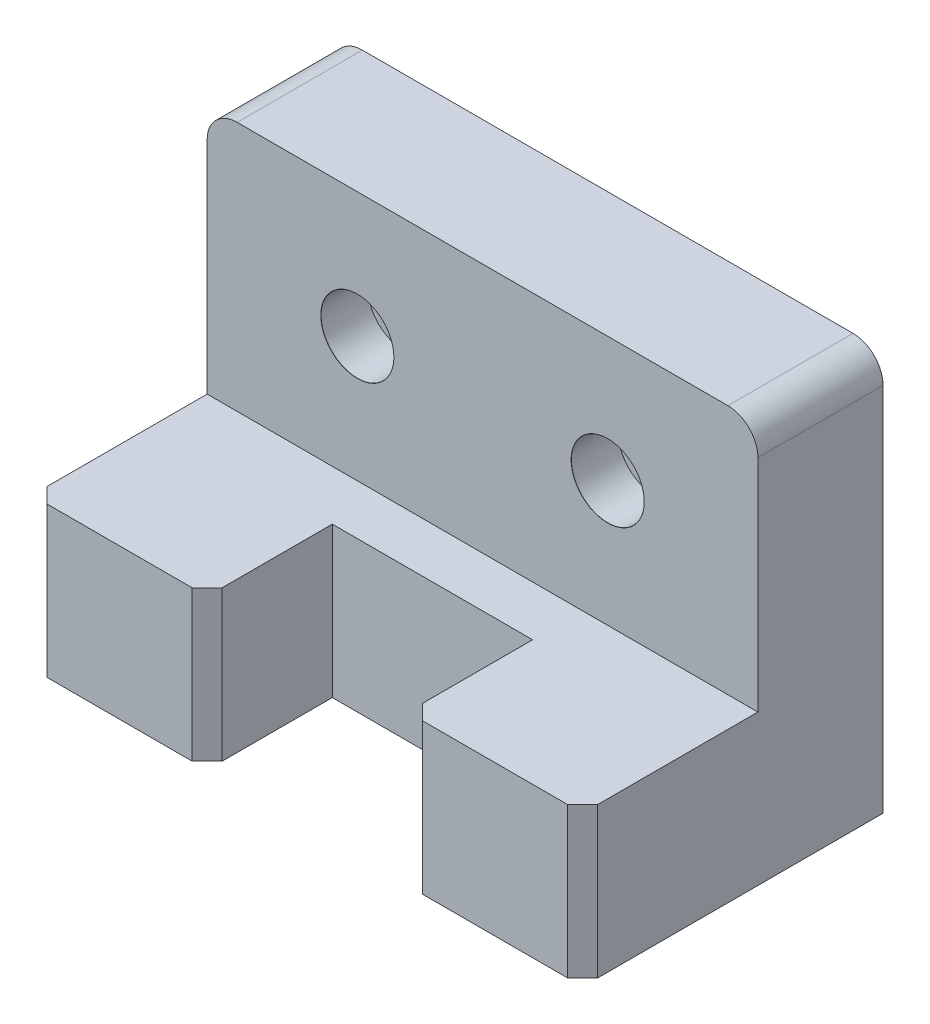
ISO-10303-21;
HEADER;
FILE_DESCRIPTION(('STEP AP214'),'2;1');
FILE_NAME('part.step','',(''),(''),'','','');
FILE_SCHEMA(('AUTOMOTIVE_DESIGN { 1 0 10303 214 1 1 1 1 }'));
ENDSEC;
DATA;
#1=APPLICATION_CONTEXT('core data for automotive mechanical design processes');
#2=APPLICATION_PROTOCOL_DEFINITION('international standard','automotive_design',2000,#1);
#3=PRODUCT_CONTEXT('',#1,'mechanical');
#4=PRODUCT('Part','Part','',(#3));
#5=PRODUCT_RELATED_PRODUCT_CATEGORY('part','',(#4));
#6=PRODUCT_DEFINITION_FORMATION('','',#4);
#7=PRODUCT_DEFINITION_CONTEXT('part definition',#1,'design');
#8=PRODUCT_DEFINITION('design','',#6,#7);
#9=PRODUCT_DEFINITION_SHAPE('','',#8);
#10=(LENGTH_UNIT() NAMED_UNIT(*) SI_UNIT(.MILLI.,.METRE.));
#11=(NAMED_UNIT(*) PLANE_ANGLE_UNIT() SI_UNIT($,.RADIAN.));
#12=(NAMED_UNIT(*) SI_UNIT($,.STERADIAN.) SOLID_ANGLE_UNIT());
#13=UNCERTAINTY_MEASURE_WITH_UNIT(LENGTH_MEASURE(1.E-05),#10,'distance_accuracy_value','');
#14=(GEOMETRIC_REPRESENTATION_CONTEXT(3) GLOBAL_UNCERTAINTY_ASSIGNED_CONTEXT((#13)) GLOBAL_UNIT_ASSIGNED_CONTEXT((#10,
#11,#12)) REPRESENTATION_CONTEXT('',''));
#15=CARTESIAN_POINT('',(0.,0.,0.));
#16=DIRECTION('',(0.,0.,1.));
#17=DIRECTION('',(1.,0.,0.));
#18=AXIS2_PLACEMENT_3D('',#15,#16,#17);
#19=CARTESIAN_POINT('',(-55.,80.,57.));
#20=DIRECTION('',(0.707106781186548,0.,-0.707106781186548));
#21=DIRECTION('',(-0.707106781186548,0.,-0.707106781186548));
#22=AXIS2_PLACEMENT_3D('',#19,#20,#21);
#23=PLANE('',#22);
#24=DIRECTION('',(0.707106781186548,0.,0.707106781186548));
#25=VECTOR('',#24,1.);
#26=CARTESIAN_POINT('',(-55.,30.,57.));
#27=LINE('',#26,#25);
#28=CARTESIAN_POINT('',(-55.,30.,57.));
#29=VERTEX_POINT('',#28);
#30=CARTESIAN_POINT('',(-52.,30.,60.));
#31=VERTEX_POINT('',#30);
#32=EDGE_CURVE('E184',#29,#31,#27,.T.);
#33=ORIENTED_EDGE('',*,*,#32,.F.);
#34=DIRECTION('',(0.,-1.,0.));
#35=VECTOR('',#34,1.);
#36=CARTESIAN_POINT('',(-55.,80.,57.));
#37=LINE('',#36,#35);
#38=CARTESIAN_POINT('',(-55.,0.,57.));
#39=VERTEX_POINT('',#38);
#40=EDGE_CURVE('E181',#29,#39,#37,.T.);
#41=ORIENTED_EDGE('',*,*,#40,.T.);
#42=DIRECTION('',(0.707106781186547,0.,0.707106781186547));
#43=VECTOR('',#42,1.);
#44=CARTESIAN_POINT('',(-55.,0.,57.));
#45=LINE('',#44,#43);
#46=CARTESIAN_POINT('',(-52.,0.,60.));
#47=VERTEX_POINT('',#46);
#48=EDGE_CURVE('E188',#39,#47,#45,.T.);
#49=ORIENTED_EDGE('',*,*,#48,.T.);
#50=DIRECTION('',(0.,-1.,0.));
#51=VECTOR('',#50,1.);
#52=CARTESIAN_POINT('',(-52.,80.,60.));
#53=LINE('',#52,#51);
#54=EDGE_CURVE('E271',#31,#47,#53,.T.);
#55=ORIENTED_EDGE('',*,*,#54,.F.);
#56=EDGE_LOOP('',(#33,#41,#49,#55));
#57=FACE_BOUND('',#56,.T.);
#58=ADVANCED_FACE('F45',(#57),#23,.F.);
#59=CARTESIAN_POINT('',(-52.,80.,60.));
#60=DIRECTION('',(0.,0.,-1.));
#61=DIRECTION('',(-1.,0.,0.));
#62=AXIS2_PLACEMENT_3D('',#59,#60,#61);
#63=PLANE('',#62);
#64=DIRECTION('',(1.,0.,0.));
#65=VECTOR('',#64,1.);
#66=CARTESIAN_POINT('',(-52.,30.,60.));
#67=LINE('',#66,#65);
#68=CARTESIAN_POINT('',(-23.,30.,60.));
#69=VERTEX_POINT('',#68);
#70=EDGE_CURVE('E190',#31,#69,#67,.T.);
#71=ORIENTED_EDGE('',*,*,#70,.F.);
#72=ORIENTED_EDGE('',*,*,#54,.T.);
#73=DIRECTION('',(1.,0.,0.));
#74=VECTOR('',#73,1.);
#75=CARTESIAN_POINT('',(-52.,0.,60.));
#76=LINE('',#75,#74);
#77=CARTESIAN_POINT('',(-23.,0.,60.));
#78=VERTEX_POINT('',#77);
#79=EDGE_CURVE('E203',#47,#78,#76,.T.);
#80=ORIENTED_EDGE('',*,*,#79,.T.);
#81=DIRECTION('',(0.,-1.,0.));
#82=VECTOR('',#81,1.);
#83=CARTESIAN_POINT('',(-23.,80.,60.));
#84=LINE('',#83,#82);
#85=EDGE_CURVE('E268',#69,#78,#84,.T.);
#86=ORIENTED_EDGE('',*,*,#85,.F.);
#87=EDGE_LOOP('',(#71,#72,#80,#86));
#88=FACE_BOUND('',#87,.T.);
#89=ADVANCED_FACE('F332',(#88),#63,.F.);
#90=CARTESIAN_POINT('',(-23.,80.,60.));
#91=DIRECTION('',(-0.707106781186548,0.,-0.707106781186547));
#92=DIRECTION('',(-0.707106781186547,0.,0.707106781186548));
#93=AXIS2_PLACEMENT_3D('',#90,#91,#92);
#94=PLANE('',#93);
#95=DIRECTION('',(0.707106781186547,0.,-0.707106781186548));
#96=VECTOR('',#95,1.);
#97=CARTESIAN_POINT('',(-23.,30.,60.));
#98=LINE('',#97,#96);
#99=CARTESIAN_POINT('',(-20.,30.,57.));
#100=VERTEX_POINT('',#99);
#101=EDGE_CURVE('E382',#69,#100,#98,.T.);
#102=ORIENTED_EDGE('',*,*,#101,.F.);
#103=ORIENTED_EDGE('',*,*,#85,.T.);
#104=DIRECTION('',(0.707106781186547,0.,-0.707106781186548));
#105=VECTOR('',#104,1.);
#106=CARTESIAN_POINT('',(-23.,0.,60.));
#107=LINE('',#106,#105);
#108=CARTESIAN_POINT('',(-20.,0.,57.));
#109=VERTEX_POINT('',#108);
#110=EDGE_CURVE('E207',#78,#109,#107,.T.);
#111=ORIENTED_EDGE('',*,*,#110,.T.);
#112=DIRECTION('',(0.,-1.,0.));
#113=VECTOR('',#112,1.);
#114=CARTESIAN_POINT('',(-20.,80.,57.));
#115=LINE('',#114,#113);
#116=EDGE_CURVE('E265',#100,#109,#115,.T.);
#117=ORIENTED_EDGE('',*,*,#116,.F.);
#118=EDGE_LOOP('',(#102,#103,#111,#117));
#119=FACE_BOUND('',#118,.T.);
#120=ADVANCED_FACE('F338',(#119),#94,.F.);
#121=CARTESIAN_POINT('',(-20.,80.,57.));
#122=DIRECTION('',(-1.,0.,0.));
#123=DIRECTION('',(0.,0.,1.));
#124=AXIS2_PLACEMENT_3D('',#121,#122,#123);
#125=PLANE('',#124);
#126=DIRECTION('',(0.,0.,-1.));
#127=VECTOR('',#126,1.);
#128=CARTESIAN_POINT('',(-20.,30.,57.));
#129=LINE('',#128,#127);
#130=CARTESIAN_POINT('',(-20.,30.,35.));
#131=VERTEX_POINT('',#130);
#132=EDGE_CURVE('E386',#100,#131,#129,.T.);
#133=ORIENTED_EDGE('',*,*,#132,.F.);
#134=ORIENTED_EDGE('',*,*,#116,.T.);
#135=DIRECTION('',(0.,0.,-1.));
#136=VECTOR('',#135,1.);
#137=CARTESIAN_POINT('',(-20.,0.,57.));
#138=LINE('',#137,#136);
#139=CARTESIAN_POINT('',(-20.,0.,35.));
#140=VERTEX_POINT('',#139);
#141=EDGE_CURVE('E211',#109,#140,#138,.T.);
#142=ORIENTED_EDGE('',*,*,#141,.T.);
#143=DIRECTION('',(0.,-1.,0.));
#144=VECTOR('',#143,1.);
#145=CARTESIAN_POINT('',(-20.,80.,35.));
#146=LINE('',#145,#144);
#147=EDGE_CURVE('E262',#131,#140,#146,.T.);
#148=ORIENTED_EDGE('',*,*,#147,.F.);
#149=EDGE_LOOP('',(#133,#134,#142,#148));
#150=FACE_BOUND('',#149,.T.);
#151=ADVANCED_FACE('F372',(#150),#125,.F.);
#152=CARTESIAN_POINT('',(-20.,80.,35.));
#153=DIRECTION('',(0.,0.,-1.));
#154=DIRECTION('',(-1.,0.,0.));
#155=AXIS2_PLACEMENT_3D('',#152,#153,#154);
#156=PLANE('',#155);
#157=DIRECTION('',(1.,0.,0.));
#158=VECTOR('',#157,1.);
#159=CARTESIAN_POINT('',(-20.,30.,35.));
#160=LINE('',#159,#158);
#161=CARTESIAN_POINT('',(20.,30.,35.));
#162=VERTEX_POINT('',#161);
#163=EDGE_CURVE('E398',#131,#162,#160,.T.);
#164=ORIENTED_EDGE('',*,*,#163,.F.);
#165=ORIENTED_EDGE('',*,*,#147,.T.);
#166=DIRECTION('',(1.,0.,0.));
#167=VECTOR('',#166,1.);
#168=CARTESIAN_POINT('',(-20.,0.,35.));
#169=LINE('',#168,#167);
#170=CARTESIAN_POINT('',(20.,0.,35.));
#171=VERTEX_POINT('',#170);
#172=EDGE_CURVE('E215',#140,#171,#169,.T.);
#173=ORIENTED_EDGE('',*,*,#172,.T.);
#174=DIRECTION('',(0.,-1.,0.));
#175=VECTOR('',#174,1.);
#176=CARTESIAN_POINT('',(20.,80.,35.));
#177=LINE('',#176,#175);
#178=EDGE_CURVE('E259',#162,#171,#177,.T.);
#179=ORIENTED_EDGE('',*,*,#178,.F.);
#180=EDGE_LOOP('',(#164,#165,#173,#179));
#181=FACE_BOUND('',#180,.T.);
#182=ADVANCED_FACE('F368',(#181),#156,.F.);
#183=CARTESIAN_POINT('',(20.,80.,35.));
#184=DIRECTION('',(1.,0.,0.));
#185=DIRECTION('',(0.,0.,-1.));
#186=AXIS2_PLACEMENT_3D('',#183,#184,#185);
#187=PLANE('',#186);
#188=DIRECTION('',(0.,0.,1.));
#189=VECTOR('',#188,1.);
#190=CARTESIAN_POINT('',(20.,30.,35.));
#191=LINE('',#190,#189);
#192=CARTESIAN_POINT('',(20.,30.,57.));
#193=VERTEX_POINT('',#192);
#194=EDGE_CURVE('E401',#162,#193,#191,.T.);
#195=ORIENTED_EDGE('',*,*,#194,.F.);
#196=ORIENTED_EDGE('',*,*,#178,.T.);
#197=DIRECTION('',(0.,0.,1.));
#198=VECTOR('',#197,1.);
#199=CARTESIAN_POINT('',(20.,0.,35.));
#200=LINE('',#199,#198);
#201=CARTESIAN_POINT('',(20.,0.,57.));
#202=VERTEX_POINT('',#201);
#203=EDGE_CURVE('E219',#171,#202,#200,.T.);
#204=ORIENTED_EDGE('',*,*,#203,.T.);
#205=DIRECTION('',(0.,-1.,0.));
#206=VECTOR('',#205,1.);
#207=CARTESIAN_POINT('',(20.,80.,57.));
#208=LINE('',#207,#206);
#209=EDGE_CURVE('E256',#193,#202,#208,.T.);
#210=ORIENTED_EDGE('',*,*,#209,.F.);
#211=EDGE_LOOP('',(#195,#196,#204,#210));
#212=FACE_BOUND('',#211,.T.);
#213=ADVANCED_FACE('F364',(#212),#187,.F.);
#214=CARTESIAN_POINT('',(20.,80.,57.));
#215=DIRECTION('',(0.707106781186548,0.,-0.707106781186547));
#216=DIRECTION('',(-0.707106781186547,0.,-0.707106781186548));
#217=AXIS2_PLACEMENT_3D('',#214,#215,#216);
#218=PLANE('',#217);
#219=DIRECTION('',(0.707106781186547,0.,0.707106781186548));
#220=VECTOR('',#219,1.);
#221=CARTESIAN_POINT('',(20.,30.,57.));
#222=LINE('',#221,#220);
#223=CARTESIAN_POINT('',(23.,30.,60.));
#224=VERTEX_POINT('',#223);
#225=EDGE_CURVE('E407',#193,#224,#222,.T.);
#226=ORIENTED_EDGE('',*,*,#225,.F.);
#227=ORIENTED_EDGE('',*,*,#209,.T.);
#228=DIRECTION('',(0.707106781186547,0.,0.707106781186548));
#229=VECTOR('',#228,1.);
#230=CARTESIAN_POINT('',(20.,0.,57.));
#231=LINE('',#230,#229);
#232=CARTESIAN_POINT('',(23.,0.,60.));
#233=VERTEX_POINT('',#232);
#234=EDGE_CURVE('E223',#202,#233,#231,.T.);
#235=ORIENTED_EDGE('',*,*,#234,.T.);
#236=DIRECTION('',(0.,-1.,0.));
#237=VECTOR('',#236,1.);
#238=CARTESIAN_POINT('',(23.,80.,60.));
#239=LINE('',#238,#237);
#240=EDGE_CURVE('E253',#224,#233,#239,.T.);
#241=ORIENTED_EDGE('',*,*,#240,.F.);
#242=EDGE_LOOP('',(#226,#227,#235,#241));
#243=FACE_BOUND('',#242,.T.);
#244=ADVANCED_FACE('F356',(#243),#218,.F.);
#245=CARTESIAN_POINT('',(23.,80.,60.));
#246=DIRECTION('',(0.,0.,-1.));
#247=DIRECTION('',(-1.,0.,0.));
#248=AXIS2_PLACEMENT_3D('',#245,#246,#247);
#249=PLANE('',#248);
#250=DIRECTION('',(1.,0.,0.));
#251=VECTOR('',#250,1.);
#252=CARTESIAN_POINT('',(23.,30.,60.));
#253=LINE('',#252,#251);
#254=CARTESIAN_POINT('',(52.,30.,60.));
#255=VERTEX_POINT('',#254);
#256=EDGE_CURVE('E410',#224,#255,#253,.T.);
#257=ORIENTED_EDGE('',*,*,#256,.F.);
#258=ORIENTED_EDGE('',*,*,#240,.T.);
#259=DIRECTION('',(1.,0.,0.));
#260=VECTOR('',#259,1.);
#261=CARTESIAN_POINT('',(23.,0.,60.));
#262=LINE('',#261,#260);
#263=CARTESIAN_POINT('',(52.,0.,60.));
#264=VERTEX_POINT('',#263);
#265=EDGE_CURVE('E227',#233,#264,#262,.T.);
#266=ORIENTED_EDGE('',*,*,#265,.T.);
#267=DIRECTION('',(0.,-1.,0.));
#268=VECTOR('',#267,1.);
#269=CARTESIAN_POINT('',(52.,80.,60.));
#270=LINE('',#269,#268);
#271=EDGE_CURVE('E250',#255,#264,#270,.T.);
#272=ORIENTED_EDGE('',*,*,#271,.F.);
#273=EDGE_LOOP('',(#257,#258,#266,#272));
#274=FACE_BOUND('',#273,.T.);
#275=ADVANCED_FACE('F350',(#274),#249,.F.);
#276=CARTESIAN_POINT('',(52.,80.,60.));
#277=DIRECTION('',(-0.707106781186548,0.,-0.707106781186548));
#278=DIRECTION('',(-0.707106781186548,0.,0.707106781186548));
#279=AXIS2_PLACEMENT_3D('',#276,#277,#278);
#280=PLANE('',#279);
#281=DIRECTION('',(0.707106781186548,0.,-0.707106781186548));
#282=VECTOR('',#281,1.);
#283=CARTESIAN_POINT('',(52.,30.,60.));
#284=LINE('',#283,#282);
#285=CARTESIAN_POINT('',(55.,30.,57.));
#286=VERTEX_POINT('',#285);
#287=EDGE_CURVE('E165',#255,#286,#284,.T.);
#288=ORIENTED_EDGE('',*,*,#287,.F.);
#289=ORIENTED_EDGE('',*,*,#271,.T.);
#290=DIRECTION('',(0.707106781186547,0.,-0.707106781186547));
#291=VECTOR('',#290,1.);
#292=CARTESIAN_POINT('',(52.,0.,60.));
#293=LINE('',#292,#291);
#294=CARTESIAN_POINT('',(55.,0.,57.));
#295=VERTEX_POINT('',#294);
#296=EDGE_CURVE('E231',#264,#295,#293,.T.);
#297=ORIENTED_EDGE('',*,*,#296,.T.);
#298=DIRECTION('',(0.,-1.,0.));
#299=VECTOR('',#298,1.);
#300=CARTESIAN_POINT('',(55.,80.,57.));
#301=LINE('',#300,#299);
#302=EDGE_CURVE('E247',#286,#295,#301,.T.);
#303=ORIENTED_EDGE('',*,*,#302,.F.);
#304=EDGE_LOOP('',(#288,#289,#297,#303));
#305=FACE_BOUND('',#304,.T.);
#306=ADVANCED_FACE('F344',(#305),#280,.F.);
#307=CARTESIAN_POINT('',(-55.,80.,0.));
#308=DIRECTION('',(1.,0.,0.));
#309=DIRECTION('',(0.,0.,-1.));
#310=AXIS2_PLACEMENT_3D('',#307,#308,#309);
#311=PLANE('',#310);
#312=DIRECTION('',(0.,1.,0.));
#313=VECTOR('',#312,1.);
#314=CARTESIAN_POINT('',(-55.,80.,25.));
#315=LINE('',#314,#313);
#316=CARTESIAN_POINT('',(-55.,30.,25.));
#317=VERTEX_POINT('',#316);
#318=CARTESIAN_POINT('',(-55.,74.,25.));
#319=VERTEX_POINT('',#318);
#320=EDGE_CURVE('E157',#317,#319,#315,.T.);
#321=ORIENTED_EDGE('',*,*,#320,.T.);
#322=DIRECTION('',(0.,0.,1.));
#323=VECTOR('',#322,1.);
#324=CARTESIAN_POINT('',(-55.,74.,0.));
#325=LINE('',#324,#323);
#326=CARTESIAN_POINT('',(-55.,74.,0.));
#327=VERTEX_POINT('',#326);
#328=EDGE_CURVE('E12',#319,#327,#325,.F.);
#329=ORIENTED_EDGE('',*,*,#328,.T.);
#330=DIRECTION('',(0.,-1.,0.));
#331=VECTOR('',#330,1.);
#332=CARTESIAN_POINT('',(-55.,80.,0.));
#333=LINE('',#332,#331);
#334=CARTESIAN_POINT('',(-55.,0.,0.));
#335=VERTEX_POINT('',#334);
#336=EDGE_CURVE('E197',#327,#335,#333,.T.);
#337=ORIENTED_EDGE('',*,*,#336,.T.);
#338=DIRECTION('',(0.,0.,1.));
#339=VECTOR('',#338,1.);
#340=CARTESIAN_POINT('',(-55.,0.,0.));
#341=LINE('',#340,#339);
#342=EDGE_CURVE('E183',#335,#39,#341,.T.);
#343=ORIENTED_EDGE('',*,*,#342,.T.);
#344=ORIENTED_EDGE('',*,*,#40,.F.);
#345=DIRECTION('',(0.,0.,1.));
#346=VECTOR('',#345,1.);
#347=CARTESIAN_POINT('',(-55.,30.,0.));
#348=LINE('',#347,#346);
#349=EDGE_CURVE('E171',#317,#29,#348,.T.);
#350=ORIENTED_EDGE('',*,*,#349,.F.);
#351=EDGE_LOOP('',(#321,#329,#337,#343,#344,#350));
#352=FACE_BOUND('',#351,.T.);
#353=ADVANCED_FACE('F179',(#352),#311,.F.);
#354=CARTESIAN_POINT('',(55.,80.,0.));
#355=DIRECTION('',(-1.,0.,0.));
#356=DIRECTION('',(0.,0.,1.));
#357=AXIS2_PLACEMENT_3D('',#354,#355,#356);
#358=PLANE('',#357);
#359=DIRECTION('',(0.,-1.,0.));
#360=VECTOR('',#359,1.);
#361=CARTESIAN_POINT('',(55.,80.,0.));
#362=LINE('',#361,#360);
#363=CARTESIAN_POINT('',(55.,74.,0.));
#364=VERTEX_POINT('',#363);
#365=CARTESIAN_POINT('',(55.,0.,0.));
#366=VERTEX_POINT('',#365);
#367=EDGE_CURVE('E244',#364,#366,#362,.T.);
#368=ORIENTED_EDGE('',*,*,#367,.F.);
#369=DIRECTION('',(0.,0.,-1.));
#370=VECTOR('',#369,1.);
#371=CARTESIAN_POINT('',(55.,74.,25.));
#372=LINE('',#371,#370);
#373=CARTESIAN_POINT('',(55.,74.,25.));
#374=VERTEX_POINT('',#373);
#375=EDGE_CURVE('E69',#364,#374,#372,.F.);
#376=ORIENTED_EDGE('',*,*,#375,.T.);
#377=DIRECTION('',(0.,-1.,0.));
#378=VECTOR('',#377,1.);
#379=CARTESIAN_POINT('',(55.,80.,25.));
#380=LINE('',#379,#378);
#381=CARTESIAN_POINT('',(55.,30.,25.));
#382=VERTEX_POINT('',#381);
#383=EDGE_CURVE('E166',#374,#382,#380,.T.);
#384=ORIENTED_EDGE('',*,*,#383,.T.);
#385=DIRECTION('',(0.,0.,-1.));
#386=VECTOR('',#385,1.);
#387=CARTESIAN_POINT('',(55.,30.,0.));
#388=LINE('',#387,#386);
#389=EDGE_CURVE('E174',#286,#382,#388,.T.);
#390=ORIENTED_EDGE('',*,*,#389,.F.);
#391=ORIENTED_EDGE('',*,*,#302,.T.);
#392=DIRECTION('',(0.,0.,-1.));
#393=VECTOR('',#392,1.);
#394=CARTESIAN_POINT('',(55.,0.,0.));
#395=LINE('',#394,#393);
#396=EDGE_CURVE('E235',#295,#366,#395,.T.);
#397=ORIENTED_EDGE('',*,*,#396,.T.);
#398=EDGE_LOOP('',(#368,#376,#384,#390,#391,#397));
#399=FACE_BOUND('',#398,.T.);
#400=ADVANCED_FACE('F310',(#399),#358,.F.);
#401=CARTESIAN_POINT('',(-55.,80.,0.));
#402=DIRECTION('',(0.,0.,1.));
#403=DIRECTION('',(1.,0.,0.));
#404=AXIS2_PLACEMENT_3D('',#401,#402,#403);
#405=PLANE('',#404);
#406=CARTESIAN_POINT('',(-25.,55.,0.));
#407=DIRECTION('',(0.,0.,1.));
#408=DIRECTION('',(1.,0.,0.));
#409=AXIS2_PLACEMENT_3D('',#406,#407,#408);
#410=CIRCLE('',#409,3.2);
#411=CARTESIAN_POINT('',(-21.8,55.,0.));
#412=VERTEX_POINT('',#411);
#413=EDGE_CURVE('E436',#412,#412,#410,.T.);
#414=ORIENTED_EDGE('',*,*,#413,.T.);
#415=EDGE_LOOP('',(#414));
#416=FACE_BOUND('',#415,.T.);
#417=CARTESIAN_POINT('',(25.,55.,0.));
#418=DIRECTION('',(0.,0.,1.));
#419=DIRECTION('',(1.,0.,0.));
#420=AXIS2_PLACEMENT_3D('',#417,#418,#419);
#421=CIRCLE('',#420,3.2);
#422=CARTESIAN_POINT('',(28.2,55.,0.));
#423=VERTEX_POINT('',#422);
#424=EDGE_CURVE('E176',#423,#423,#421,.T.);
#425=ORIENTED_EDGE('',*,*,#424,.T.);
#426=EDGE_LOOP('',(#425));
#427=FACE_BOUND('',#426,.T.);
#428=DIRECTION('',(-1.,0.,0.));
#429=VECTOR('',#428,1.);
#430=CARTESIAN_POINT('',(-55.,80.,0.));
#431=LINE('',#430,#429);
#432=CARTESIAN_POINT('',(49.,80.,0.));
#433=VERTEX_POINT('',#432);
#434=CARTESIAN_POINT('',(-49.,80.,0.));
#435=VERTEX_POINT('',#434);
#436=EDGE_CURVE('E194',#433,#435,#431,.T.);
#437=ORIENTED_EDGE('',*,*,#436,.F.);
#438=CARTESIAN_POINT('',(49.,74.,0.));
#439=DIRECTION('',(0.,0.,1.));
#440=DIRECTION('',(1.,0.,0.));
#441=AXIS2_PLACEMENT_3D('',#438,#439,#440);
#442=CIRCLE('',#441,6.);
#443=EDGE_CURVE('E292',#433,#364,#442,.F.);
#444=ORIENTED_EDGE('',*,*,#443,.T.);
#445=ORIENTED_EDGE('',*,*,#367,.T.);
#446=DIRECTION('',(-1.,0.,0.));
#447=VECTOR('',#446,1.);
#448=CARTESIAN_POINT('',(-55.,0.,0.));
#449=LINE('',#448,#447);
#450=EDGE_CURVE('E198',#366,#335,#449,.T.);
#451=ORIENTED_EDGE('',*,*,#450,.T.);
#452=ORIENTED_EDGE('',*,*,#336,.F.);
#453=CARTESIAN_POINT('',(-49.,74.,0.));
#454=DIRECTION('',(0.,0.,1.));
#455=DIRECTION('',(1.,0.,0.));
#456=AXIS2_PLACEMENT_3D('',#453,#454,#455);
#457=CIRCLE('',#456,6.);
#458=EDGE_CURVE('E289',#327,#435,#457,.F.);
#459=ORIENTED_EDGE('',*,*,#458,.T.);
#460=EDGE_LOOP('',(#437,#444,#445,#451,#452,#459));
#461=FACE_BOUND('',#460,.T.);
#462=ADVANCED_FACE('F309',(#416,#427,#461),#405,.F.);
#463=CARTESIAN_POINT('',(0.,80.,0.));
#464=DIRECTION('',(0.,1.,0.));
#465=DIRECTION('',(0.,0.,1.));
#466=AXIS2_PLACEMENT_3D('',#463,#464,#465);
#467=PLANE('',#466);
#468=DIRECTION('',(-1.,0.,0.));
#469=VECTOR('',#468,1.);
#470=CARTESIAN_POINT('',(0.,80.,25.));
#471=LINE('',#470,#469);
#472=CARTESIAN_POINT('',(49.,80.,25.));
#473=VERTEX_POINT('',#472);
#474=CARTESIAN_POINT('',(-49.,80.,25.));
#475=VERTEX_POINT('',#474);
#476=EDGE_CURVE('E276',#473,#475,#471,.T.);
#477=ORIENTED_EDGE('',*,*,#476,.F.);
#478=DIRECTION('',(0.,0.,-1.));
#479=VECTOR('',#478,1.);
#480=CARTESIAN_POINT('',(49.,80.,0.));
#481=LINE('',#480,#479);
#482=EDGE_CURVE('E285',#473,#433,#481,.T.);
#483=ORIENTED_EDGE('',*,*,#482,.T.);
#484=ORIENTED_EDGE('',*,*,#436,.T.);
#485=DIRECTION('',(0.,0.,1.));
#486=VECTOR('',#485,1.);
#487=CARTESIAN_POINT('',(-49.,80.,25.));
#488=LINE('',#487,#486);
#489=EDGE_CURVE('E281',#435,#475,#488,.T.);
#490=ORIENTED_EDGE('',*,*,#489,.T.);
#491=EDGE_LOOP('',(#477,#483,#484,#490));
#492=FACE_BOUND('',#491,.T.);
#493=ADVANCED_FACE('F304',(#492),#467,.T.);
#494=CARTESIAN_POINT('',(0.,0.,0.));
#495=DIRECTION('',(0.,1.,0.));
#496=DIRECTION('',(0.,0.,1.));
#497=AXIS2_PLACEMENT_3D('',#494,#495,#496);
#498=PLANE('',#497);
#499=ORIENTED_EDGE('',*,*,#342,.F.);
#500=ORIENTED_EDGE('',*,*,#450,.F.);
#501=ORIENTED_EDGE('',*,*,#396,.F.);
#502=ORIENTED_EDGE('',*,*,#296,.F.);
#503=ORIENTED_EDGE('',*,*,#265,.F.);
#504=ORIENTED_EDGE('',*,*,#234,.F.);
#505=ORIENTED_EDGE('',*,*,#203,.F.);
#506=ORIENTED_EDGE('',*,*,#172,.F.);
#507=ORIENTED_EDGE('',*,*,#141,.F.);
#508=ORIENTED_EDGE('',*,*,#110,.F.);
#509=ORIENTED_EDGE('',*,*,#79,.F.);
#510=ORIENTED_EDGE('',*,*,#48,.F.);
#511=EDGE_LOOP('',(#499,#500,#501,#502,#503,#504,#505,#506,#507,#508,#509,#510));
#512=FACE_BOUND('',#511,.T.);
#513=ADVANCED_FACE('F317',(#512),#498,.F.);
#514=CARTESIAN_POINT('',(0.,30.,0.));
#515=DIRECTION('',(0.,1.,0.));
#516=DIRECTION('',(0.,0.,1.));
#517=AXIS2_PLACEMENT_3D('',#514,#515,#516);
#518=PLANE('',#517);
#519=ORIENTED_EDGE('',*,*,#349,.T.);
#520=ORIENTED_EDGE('',*,*,#32,.T.);
#521=ORIENTED_EDGE('',*,*,#70,.T.);
#522=ORIENTED_EDGE('',*,*,#101,.T.);
#523=ORIENTED_EDGE('',*,*,#132,.T.);
#524=ORIENTED_EDGE('',*,*,#163,.T.);
#525=ORIENTED_EDGE('',*,*,#194,.T.);
#526=ORIENTED_EDGE('',*,*,#225,.T.);
#527=ORIENTED_EDGE('',*,*,#256,.T.);
#528=ORIENTED_EDGE('',*,*,#287,.T.);
#529=ORIENTED_EDGE('',*,*,#389,.T.);
#530=DIRECTION('',(1.,0.,0.));
#531=VECTOR('',#530,1.);
#532=CARTESIAN_POINT('',(-64.3628860619649,30.,25.));
#533=LINE('',#532,#531);
#534=EDGE_CURVE('E160',#317,#382,#533,.T.);
#535=ORIENTED_EDGE('',*,*,#534,.F.);
#536=EDGE_LOOP('',(#519,#520,#521,#522,#523,#524,#525,#526,#527,#528,#529,#535));
#537=FACE_BOUND('',#536,.T.);
#538=ADVANCED_FACE('F170',(#537),#518,.T.);
#539=CARTESIAN_POINT('',(-64.3628860619649,-136.327923675116,25.));
#540=DIRECTION('',(0.,0.,-1.));
#541=DIRECTION('',(-1.,0.,0.));
#542=AXIS2_PLACEMENT_3D('',#539,#540,#541);
#543=PLANE('',#542);
#544=CARTESIAN_POINT('',(-25.,55.,25.));
#545=DIRECTION('',(0.,0.,1.));
#546=DIRECTION('',(1.,0.,0.));
#547=AXIS2_PLACEMENT_3D('',#544,#545,#546);
#548=CIRCLE('',#547,7.3);
#549=CARTESIAN_POINT('',(-17.7,55.,25.));
#550=VERTEX_POINT('',#549);
#551=EDGE_CURVE('E452',#550,#550,#548,.T.);
#552=ORIENTED_EDGE('',*,*,#551,.F.);
#553=EDGE_LOOP('',(#552));
#554=FACE_BOUND('',#553,.T.);
#555=CARTESIAN_POINT('',(25.,55.,25.));
#556=DIRECTION('',(0.,0.,1.));
#557=DIRECTION('',(1.,0.,0.));
#558=AXIS2_PLACEMENT_3D('',#555,#556,#557);
#559=CIRCLE('',#558,7.3);
#560=CARTESIAN_POINT('',(32.3,55.,25.));
#561=VERTEX_POINT('',#560);
#562=EDGE_CURVE('E432',#561,#561,#559,.T.);
#563=ORIENTED_EDGE('',*,*,#562,.F.);
#564=EDGE_LOOP('',(#563));
#565=FACE_BOUND('',#564,.T.);
#566=ORIENTED_EDGE('',*,*,#383,.F.);
#567=CARTESIAN_POINT('',(49.,74.,25.));
#568=DIRECTION('',(0.,0.,-1.));
#569=DIRECTION('',(-1.,0.,0.));
#570=AXIS2_PLACEMENT_3D('',#567,#568,#569);
#571=CIRCLE('',#570,6.);
#572=EDGE_CURVE('E54',#374,#473,#571,.F.);
#573=ORIENTED_EDGE('',*,*,#572,.T.);
#574=ORIENTED_EDGE('',*,*,#476,.T.);
#575=CARTESIAN_POINT('',(-49.,74.,25.));
#576=DIRECTION('',(0.,0.,-1.));
#577=DIRECTION('',(-1.,0.,0.));
#578=AXIS2_PLACEMENT_3D('',#575,#576,#577);
#579=CIRCLE('',#578,6.);
#580=EDGE_CURVE('E61',#475,#319,#579,.F.);
#581=ORIENTED_EDGE('',*,*,#580,.T.);
#582=ORIENTED_EDGE('',*,*,#320,.F.);
#583=ORIENTED_EDGE('',*,*,#534,.T.);
#584=EDGE_LOOP('',(#566,#573,#574,#581,#582,#583));
#585=FACE_BOUND('',#584,.T.);
#586=ADVANCED_FACE('F159',(#554,#565,#585),#543,.F.);
#587=CARTESIAN_POINT('',(49.,74.,0.));
#588=DIRECTION('',(0.,0.,1.));
#589=DIRECTION('',(1.,0.,0.));
#590=AXIS2_PLACEMENT_3D('',#587,#588,#589);
#591=CYLINDRICAL_SURFACE('',#590,6.);
#592=ORIENTED_EDGE('',*,*,#572,.F.);
#593=ORIENTED_EDGE('',*,*,#375,.F.);
#594=ORIENTED_EDGE('',*,*,#443,.F.);
#595=ORIENTED_EDGE('',*,*,#482,.F.);
#596=EDGE_LOOP('',(#592,#593,#594,#595));
#597=FACE_BOUND('',#596,.T.);
#598=ADVANCED_FACE('F307',(#597),#591,.T.);
#599=CARTESIAN_POINT('',(-49.,74.,0.));
#600=DIRECTION('',(0.,0.,-1.));
#601=DIRECTION('',(-1.,0.,0.));
#602=AXIS2_PLACEMENT_3D('',#599,#600,#601);
#603=CYLINDRICAL_SURFACE('',#602,6.);
#604=ORIENTED_EDGE('',*,*,#458,.F.);
#605=ORIENTED_EDGE('',*,*,#328,.F.);
#606=ORIENTED_EDGE('',*,*,#580,.F.);
#607=ORIENTED_EDGE('',*,*,#489,.F.);
#608=EDGE_LOOP('',(#604,#605,#606,#607));
#609=FACE_BOUND('',#608,.T.);
#610=ADVANCED_FACE('F47',(#609),#603,.T.);
#611=CARTESIAN_POINT('',(25.,55.,25.));
#612=DIRECTION('',(0.,0.,1.));
#613=DIRECTION('',(1.,0.,0.));
#614=AXIS2_PLACEMENT_3D('',#611,#612,#613);
#615=CYLINDRICAL_SURFACE('',#614,3.2);
#616=ORIENTED_EDGE('',*,*,#424,.F.);
#617=EDGE_LOOP('',(#616));
#618=FACE_BOUND('',#617,.T.);
#619=CARTESIAN_POINT('',(25.,55.,15.62));
#620=DIRECTION('',(0.,0.,1.));
#621=DIRECTION('',(1.,0.,0.));
#622=AXIS2_PLACEMENT_3D('',#619,#620,#621);
#623=CIRCLE('',#622,3.2);
#624=CARTESIAN_POINT('',(28.2,55.,15.62));
#625=VERTEX_POINT('',#624);
#626=EDGE_CURVE('E420',#625,#625,#623,.T.);
#627=ORIENTED_EDGE('',*,*,#626,.T.);
#628=EDGE_LOOP('',(#627));
#629=FACE_BOUND('',#628,.T.);
#630=ADVANCED_FACE('F323',(#618,#629),#615,.F.);
#631=CARTESIAN_POINT('',(32.275,55.,15.62));
#632=DIRECTION('',(0.,0.,-1.));
#633=DIRECTION('',(-1.,0.,0.));
#634=AXIS2_PLACEMENT_3D('',#631,#632,#633);
#635=PLANE('',#634);
#636=ORIENTED_EDGE('',*,*,#626,.F.);
#637=EDGE_LOOP('',(#636));
#638=FACE_BOUND('',#637,.T.);
#639=CARTESIAN_POINT('',(25.,55.,15.62));
#640=DIRECTION('',(0.,0.,1.));
#641=DIRECTION('',(1.,0.,0.));
#642=AXIS2_PLACEMENT_3D('',#639,#640,#641);
#643=CIRCLE('',#642,7.275);
#644=CARTESIAN_POINT('',(32.275,55.,15.62));
#645=VERTEX_POINT('',#644);
#646=EDGE_CURVE('E424',#645,#645,#643,.T.);
#647=ORIENTED_EDGE('',*,*,#646,.T.);
#648=EDGE_LOOP('',(#647));
#649=FACE_BOUND('',#648,.T.);
#650=ADVANCED_FACE('F328',(#638,#649),#635,.F.);
#651=CARTESIAN_POINT('',(25.,55.,25.));
#652=DIRECTION('',(0.,0.,1.));
#653=DIRECTION('',(1.,0.,0.));
#654=AXIS2_PLACEMENT_3D('',#651,#652,#653);
#655=CYLINDRICAL_SURFACE('',#654,7.275);
#656=ORIENTED_EDGE('',*,*,#646,.F.);
#657=EDGE_LOOP('',(#656));
#658=FACE_BOUND('',#657,.T.);
#659=CARTESIAN_POINT('',(25.,55.,24.975));
#660=DIRECTION('',(0.,0.,1.));
#661=DIRECTION('',(1.,0.,0.));
#662=AXIS2_PLACEMENT_3D('',#659,#660,#661);
#663=CIRCLE('',#662,7.275);
#664=CARTESIAN_POINT('',(32.275,55.,24.975));
#665=VERTEX_POINT('',#664);
#666=EDGE_CURVE('E428',#665,#665,#663,.T.);
#667=ORIENTED_EDGE('',*,*,#666,.T.);
#668=EDGE_LOOP('',(#667));
#669=FACE_BOUND('',#668,.T.);
#670=ADVANCED_FACE('F467',(#658,#669),#655,.F.);
#671=CARTESIAN_POINT('',(25.,55.,25.));
#672=DIRECTION('',(0.,0.,1.));
#673=DIRECTION('',(1.,0.,0.));
#674=AXIS2_PLACEMENT_3D('',#671,#672,#673);
#675=CONICAL_SURFACE('',#674,7.3,0.785398163397518);
#676=ORIENTED_EDGE('',*,*,#666,.F.);
#677=EDGE_LOOP('',(#676));
#678=FACE_BOUND('',#677,.T.);
#679=ORIENTED_EDGE('',*,*,#562,.T.);
#680=EDGE_LOOP('',(#679));
#681=FACE_BOUND('',#680,.T.);
#682=ADVANCED_FACE('F464',(#678,#681),#675,.F.);
#683=CARTESIAN_POINT('',(-25.,55.,25.));
#684=DIRECTION('',(0.,0.,1.));
#685=DIRECTION('',(1.,0.,0.));
#686=AXIS2_PLACEMENT_3D('',#683,#684,#685);
#687=CYLINDRICAL_SURFACE('',#686,3.2);
#688=ORIENTED_EDGE('',*,*,#413,.F.);
#689=EDGE_LOOP('',(#688));
#690=FACE_BOUND('',#689,.T.);
#691=CARTESIAN_POINT('',(-25.,55.,15.62));
#692=DIRECTION('',(0.,0.,1.));
#693=DIRECTION('',(1.,0.,0.));
#694=AXIS2_PLACEMENT_3D('',#691,#692,#693);
#695=CIRCLE('',#694,3.2);
#696=CARTESIAN_POINT('',(-21.8,55.,15.62));
#697=VERTEX_POINT('',#696);
#698=EDGE_CURVE('E440',#697,#697,#695,.T.);
#699=ORIENTED_EDGE('',*,*,#698,.T.);
#700=EDGE_LOOP('',(#699));
#701=FACE_BOUND('',#700,.T.);
#702=ADVANCED_FACE('F466',(#690,#701),#687,.F.);
#703=CARTESIAN_POINT('',(-17.725,55.,15.62));
#704=DIRECTION('',(0.,0.,-1.));
#705=DIRECTION('',(-1.,0.,0.));
#706=AXIS2_PLACEMENT_3D('',#703,#704,#705);
#707=PLANE('',#706);
#708=ORIENTED_EDGE('',*,*,#698,.F.);
#709=EDGE_LOOP('',(#708));
#710=FACE_BOUND('',#709,.T.);
#711=CARTESIAN_POINT('',(-25.,55.,15.62));
#712=DIRECTION('',(0.,0.,1.));
#713=DIRECTION('',(1.,0.,0.));
#714=AXIS2_PLACEMENT_3D('',#711,#712,#713);
#715=CIRCLE('',#714,7.275);
#716=CARTESIAN_POINT('',(-17.725,55.,15.62));
#717=VERTEX_POINT('',#716);
#718=EDGE_CURVE('E444',#717,#717,#715,.T.);
#719=ORIENTED_EDGE('',*,*,#718,.T.);
#720=EDGE_LOOP('',(#719));
#721=FACE_BOUND('',#720,.T.);
#722=ADVANCED_FACE('F474',(#710,#721),#707,.F.);
#723=CARTESIAN_POINT('',(-25.,55.,25.));
#724=DIRECTION('',(0.,0.,1.));
#725=DIRECTION('',(1.,0.,0.));
#726=AXIS2_PLACEMENT_3D('',#723,#724,#725);
#727=CYLINDRICAL_SURFACE('',#726,7.275);
#728=ORIENTED_EDGE('',*,*,#718,.F.);
#729=EDGE_LOOP('',(#728));
#730=FACE_BOUND('',#729,.T.);
#731=CARTESIAN_POINT('',(-25.,55.,24.975));
#732=DIRECTION('',(0.,0.,1.));
#733=DIRECTION('',(1.,0.,0.));
#734=AXIS2_PLACEMENT_3D('',#731,#732,#733);
#735=CIRCLE('',#734,7.275);
#736=CARTESIAN_POINT('',(-17.725,55.,24.975));
#737=VERTEX_POINT('',#736);
#738=EDGE_CURVE('E448',#737,#737,#735,.T.);
#739=ORIENTED_EDGE('',*,*,#738,.T.);
#740=EDGE_LOOP('',(#739));
#741=FACE_BOUND('',#740,.T.);
#742=ADVANCED_FACE('F507',(#730,#741),#727,.F.);
#743=CARTESIAN_POINT('',(-25.,55.,25.));
#744=DIRECTION('',(0.,0.,1.));
#745=DIRECTION('',(1.,0.,0.));
#746=AXIS2_PLACEMENT_3D('',#743,#744,#745);
#747=CONICAL_SURFACE('',#746,7.3,0.785398163397448);
#748=ORIENTED_EDGE('',*,*,#738,.F.);
#749=EDGE_LOOP('',(#748));
#750=FACE_BOUND('',#749,.T.);
#751=ORIENTED_EDGE('',*,*,#551,.T.);
#752=EDGE_LOOP('',(#751));
#753=FACE_BOUND('',#752,.T.);
#754=ADVANCED_FACE('F457',(#750,#753),#747,.F.);
#755=CLOSED_SHELL('',(#58,#89,#120,#151,#182,#213,#244,#275,#306,#353,#400,#462,#493,#513,#538,
#586,#598,#610,#630,#650,#670,#682,#702,#722,#742,#754));
#756=MANIFOLD_SOLID_BREP('B2',#755);
#757=ADVANCED_BREP_SHAPE_REPRESENTATION('',(#18,#756),#14);
#758=SHAPE_DEFINITION_REPRESENTATION(#9,#757);
ENDSEC;
END-ISO-10303-21;
